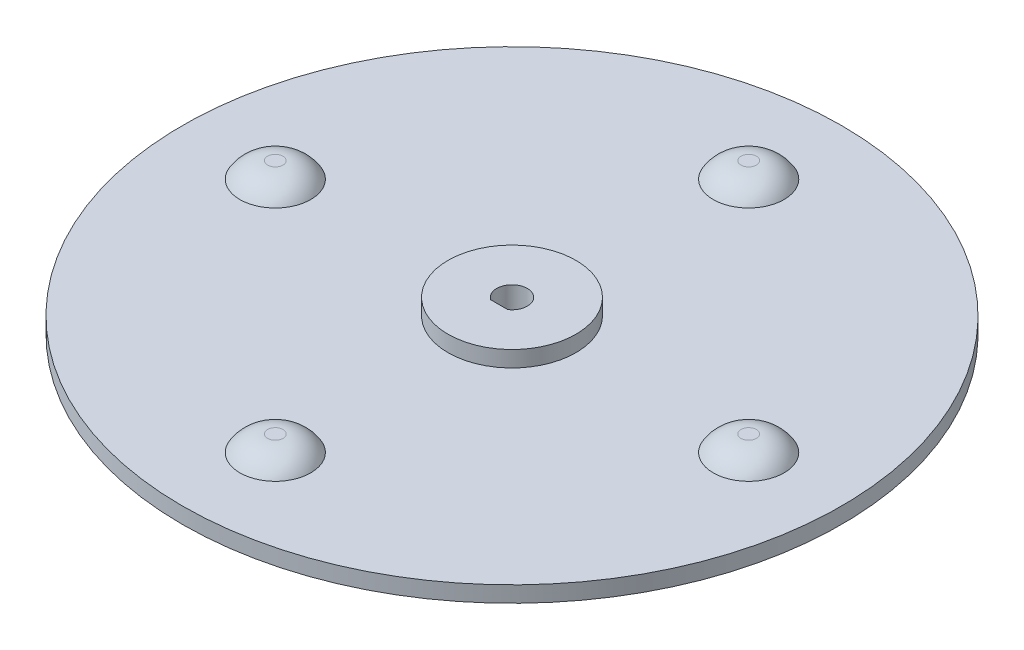
ISO-10303-21;
HEADER;
FILE_DESCRIPTION(('STEP AP214'),'2;1');
FILE_NAME('part.step','',(''),(''),'','','');
FILE_SCHEMA(('AUTOMOTIVE_DESIGN { 1 0 10303 214 1 1 1 1 }'));
ENDSEC;
DATA;
#1=APPLICATION_CONTEXT('core data for automotive mechanical design processes');
#2=APPLICATION_PROTOCOL_DEFINITION('international standard','automotive_design',2000,#1);
#3=PRODUCT_CONTEXT('',#1,'mechanical');
#4=PRODUCT('Part','Part','',(#3));
#5=PRODUCT_RELATED_PRODUCT_CATEGORY('part','',(#4));
#6=PRODUCT_DEFINITION_FORMATION('','',#4);
#7=PRODUCT_DEFINITION_CONTEXT('part definition',#1,'design');
#8=PRODUCT_DEFINITION('design','',#6,#7);
#9=PRODUCT_DEFINITION_SHAPE('','',#8);
#10=(LENGTH_UNIT() NAMED_UNIT(*) SI_UNIT(.MILLI.,.METRE.));
#11=(NAMED_UNIT(*) PLANE_ANGLE_UNIT() SI_UNIT($,.RADIAN.));
#12=(NAMED_UNIT(*) SI_UNIT($,.STERADIAN.) SOLID_ANGLE_UNIT());
#13=UNCERTAINTY_MEASURE_WITH_UNIT(LENGTH_MEASURE(1.E-05),#10,'distance_accuracy_value','');
#14=(GEOMETRIC_REPRESENTATION_CONTEXT(3) GLOBAL_UNCERTAINTY_ASSIGNED_CONTEXT((#13)) GLOBAL_UNIT_ASSIGNED_CONTEXT((#10,
#11,#12)) REPRESENTATION_CONTEXT('',''));
#15=CARTESIAN_POINT('',(0.,0.,0.));
#16=DIRECTION('',(0.,0.,1.));
#17=DIRECTION('',(1.,0.,0.));
#18=AXIS2_PLACEMENT_3D('',#15,#16,#17);
#19=CARTESIAN_POINT('',(0.,3.175,0.));
#20=DIRECTION('',(0.,-1.,0.));
#21=DIRECTION('',(0.,0.,-1.));
#22=AXIS2_PLACEMENT_3D('',#19,#20,#21);
#23=CYLINDRICAL_SURFACE('',#22,65.405);
#24=CARTESIAN_POINT('',(0.,3.175,0.));
#25=DIRECTION('',(0.,1.,0.));
#26=DIRECTION('',(0.,0.,1.));
#27=AXIS2_PLACEMENT_3D('',#24,#25,#26);
#28=CIRCLE('',#27,65.405);
#29=CARTESIAN_POINT('',(0.,3.175,65.405));
#30=VERTEX_POINT('',#29);
#31=EDGE_CURVE('E111',#30,#30,#28,.T.);
#32=ORIENTED_EDGE('',*,*,#31,.F.);
#33=EDGE_LOOP('',(#32));
#34=FACE_BOUND('',#33,.T.);
#35=CARTESIAN_POINT('',(0.,0.,0.));
#36=DIRECTION('',(0.,1.,0.));
#37=DIRECTION('',(0.,0.,1.));
#38=AXIS2_PLACEMENT_3D('',#35,#36,#37);
#39=CIRCLE('',#38,65.405);
#40=CARTESIAN_POINT('',(0.,0.,65.405));
#41=VERTEX_POINT('',#40);
#42=EDGE_CURVE('E105',#41,#41,#39,.T.);
#43=ORIENTED_EDGE('',*,*,#42,.T.);
#44=EDGE_LOOP('',(#43));
#45=FACE_BOUND('',#44,.T.);
#46=ADVANCED_FACE('F45',(#34,#45),#23,.T.);
#47=CARTESIAN_POINT('',(0.,3.175,0.));
#48=DIRECTION('',(0.,1.,0.));
#49=DIRECTION('',(0.,0.,1.));
#50=AXIS2_PLACEMENT_3D('',#47,#48,#49);
#51=PLANE('',#50);
#52=CARTESIAN_POINT('',(-46.9731498971295,3.175,-4.92017628877526E-13));
#53=DIRECTION('',(0.,1.,0.));
#54=DIRECTION('',(0.,0.,1.));
#55=AXIS2_PLACEMENT_3D('',#52,#53,#54);
#56=CIRCLE('',#55,7.03225048164094);
#57=CARTESIAN_POINT('',(-46.9731498971295,3.175,7.03225048164045));
#58=VERTEX_POINT('',#57);
#59=EDGE_CURVE('E299',#58,#58,#56,.T.);
#60=ORIENTED_EDGE('',*,*,#59,.F.);
#61=EDGE_LOOP('',(#60));
#62=FACE_BOUND('',#61,.T.);
#63=CARTESIAN_POINT('',(-3.28011752585018E-13,3.175,46.9731498971295));
#64=DIRECTION('',(0.,1.,0.));
#65=DIRECTION('',(0.,0.,1.));
#66=AXIS2_PLACEMENT_3D('',#63,#64,#65);
#67=CIRCLE('',#66,7.03225048164094);
#68=CARTESIAN_POINT('',(-3.28011752585018E-13,3.175,54.0054003787704));
#69=VERTEX_POINT('',#68);
#70=EDGE_CURVE('E296',#69,#69,#67,.T.);
#71=ORIENTED_EDGE('',*,*,#70,.F.);
#72=EDGE_LOOP('',(#71));
#73=FACE_BOUND('',#72,.T.);
#74=CARTESIAN_POINT('',(46.9731498971295,3.175,1.64005876292509E-13));
#75=DIRECTION('',(0.,1.,0.));
#76=DIRECTION('',(0.,0.,1.));
#77=AXIS2_PLACEMENT_3D('',#74,#75,#76);
#78=CIRCLE('',#77,7.03225048164094);
#79=CARTESIAN_POINT('',(46.9731498971295,3.175,7.03225048164111));
#80=VERTEX_POINT('',#79);
#81=EDGE_CURVE('E94',#80,#80,#78,.T.);
#82=ORIENTED_EDGE('',*,*,#81,.F.);
#83=EDGE_LOOP('',(#82));
#84=FACE_BOUND('',#83,.T.);
#85=CARTESIAN_POINT('',(0.,3.175,-46.9731498971295));
#86=DIRECTION('',(0.,1.,0.));
#87=DIRECTION('',(0.,0.,1.));
#88=AXIS2_PLACEMENT_3D('',#85,#86,#87);
#89=CIRCLE('',#88,7.03225048164094);
#90=CARTESIAN_POINT('',(0.,3.175,-39.9408994154885));
#91=VERTEX_POINT('',#90);
#92=EDGE_CURVE('E90',#91,#91,#89,.T.);
#93=ORIENTED_EDGE('',*,*,#92,.F.);
#94=EDGE_LOOP('',(#93));
#95=FACE_BOUND('',#94,.T.);
#96=CARTESIAN_POINT('',(0.,3.175,0.));
#97=DIRECTION('',(0.,1.,0.));
#98=DIRECTION('',(0.,0.,1.));
#99=AXIS2_PLACEMENT_3D('',#96,#97,#98);
#100=CIRCLE('',#99,12.7);
#101=CARTESIAN_POINT('',(0.,3.175,12.7));
#102=VERTEX_POINT('',#101);
#103=EDGE_CURVE('E106',#102,#102,#100,.T.);
#104=ORIENTED_EDGE('',*,*,#103,.F.);
#105=EDGE_LOOP('',(#104));
#106=FACE_BOUND('',#105,.T.);
#107=ORIENTED_EDGE('',*,*,#31,.T.);
#108=EDGE_LOOP('',(#107));
#109=FACE_BOUND('',#108,.T.);
#110=ADVANCED_FACE('F144',(#62,#73,#84,#95,#106,#109),#51,.T.);
#111=CARTESIAN_POINT('',(0.,0.,0.));
#112=DIRECTION('',(0.,1.,0.));
#113=DIRECTION('',(0.,0.,1.));
#114=AXIS2_PLACEMENT_3D('',#111,#112,#113);
#115=PLANE('',#114);
#116=ORIENTED_EDGE('',*,*,#42,.F.);
#117=EDGE_LOOP('',(#116));
#118=FACE_BOUND('',#117,.T.);
#119=ADVANCED_FACE('F151',(#118),#115,.F.);
#120=CARTESIAN_POINT('',(0.,6.35,0.));
#121=DIRECTION('',(0.,-1.,0.));
#122=DIRECTION('',(0.,0.,-1.));
#123=AXIS2_PLACEMENT_3D('',#120,#121,#122);
#124=CYLINDRICAL_SURFACE('',#123,12.7);
#125=CARTESIAN_POINT('',(0.,6.35,0.));
#126=DIRECTION('',(0.,1.,0.));
#127=DIRECTION('',(0.,0.,1.));
#128=AXIS2_PLACEMENT_3D('',#125,#126,#127);
#129=CIRCLE('',#128,12.7);
#130=CARTESIAN_POINT('',(0.,6.35,12.7));
#131=VERTEX_POINT('',#130);
#132=EDGE_CURVE('E78',#131,#131,#129,.T.);
#133=ORIENTED_EDGE('',*,*,#132,.F.);
#134=EDGE_LOOP('',(#133));
#135=FACE_BOUND('',#134,.T.);
#136=ORIENTED_EDGE('',*,*,#103,.T.);
#137=EDGE_LOOP('',(#136));
#138=FACE_BOUND('',#137,.T.);
#139=ADVANCED_FACE('F191',(#135,#138),#124,.T.);
#140=CARTESIAN_POINT('',(0.,6.35,0.));
#141=DIRECTION('',(0.,1.,0.));
#142=DIRECTION('',(0.,0.,1.));
#143=AXIS2_PLACEMENT_3D('',#140,#141,#142);
#144=PLANE('',#143);
#145=CARTESIAN_POINT('',(0.,6.35,0.));
#146=DIRECTION('',(0.,1.,0.));
#147=DIRECTION('',(0.,0.,1.));
#148=AXIS2_PLACEMENT_3D('',#145,#146,#147);
#149=CIRCLE('',#148,3.048);
#150=CARTESIAN_POINT('',(1.68484539350054,6.35,2.54));
#151=VERTEX_POINT('',#150);
#152=CARTESIAN_POINT('',(-1.68484539350054,6.35,2.54));
#153=VERTEX_POINT('',#152);
#154=EDGE_CURVE('E61',#151,#153,#149,.T.);
#155=ORIENTED_EDGE('',*,*,#154,.F.);
#156=DIRECTION('',(1.,0.,0.));
#157=VECTOR('',#156,1.);
#158=CARTESIAN_POINT('',(-1.68484539350054,6.35,2.54));
#159=LINE('',#158,#157);
#160=EDGE_CURVE('E82',#153,#151,#159,.T.);
#161=ORIENTED_EDGE('',*,*,#160,.F.);
#162=EDGE_LOOP('',(#155,#161));
#163=FACE_BOUND('',#162,.T.);
#164=ORIENTED_EDGE('',*,*,#132,.T.);
#165=EDGE_LOOP('',(#164));
#166=FACE_BOUND('',#165,.T.);
#167=ADVANCED_FACE('F87',(#163,#166),#144,.T.);
#168=CARTESIAN_POINT('',(0.,0.508,0.));
#169=DIRECTION('',(0.,1.,0.));
#170=DIRECTION('',(0.,0.,1.));
#171=AXIS2_PLACEMENT_3D('',#168,#169,#170);
#172=CYLINDRICAL_SURFACE('',#171,3.048);
#173=ORIENTED_EDGE('',*,*,#154,.T.);
#174=DIRECTION('',(0.,1.,0.));
#175=VECTOR('',#174,1.);
#176=CARTESIAN_POINT('',(-1.68484539350054,0.508,2.54));
#177=LINE('',#176,#175);
#178=CARTESIAN_POINT('',(-1.68484539350054,0.508,2.54));
#179=VERTEX_POINT('',#178);
#180=EDGE_CURVE('E79',#179,#153,#177,.T.);
#181=ORIENTED_EDGE('',*,*,#180,.F.);
#182=CARTESIAN_POINT('',(0.,0.508,0.));
#183=DIRECTION('',(0.,1.,0.));
#184=DIRECTION('',(0.,0.,1.));
#185=AXIS2_PLACEMENT_3D('',#182,#183,#184);
#186=CIRCLE('',#185,3.048);
#187=CARTESIAN_POINT('',(1.68484539350054,0.508,2.54));
#188=VERTEX_POINT('',#187);
#189=EDGE_CURVE('E75',#188,#179,#186,.T.);
#190=ORIENTED_EDGE('',*,*,#189,.F.);
#191=DIRECTION('',(0.,1.,0.));
#192=VECTOR('',#191,1.);
#193=CARTESIAN_POINT('',(1.68484539350054,0.508,2.54));
#194=LINE('',#193,#192);
#195=EDGE_CURVE('E69',#188,#151,#194,.T.);
#196=ORIENTED_EDGE('',*,*,#195,.T.);
#197=EDGE_LOOP('',(#173,#181,#190,#196));
#198=FACE_BOUND('',#197,.T.);
#199=ADVANCED_FACE('F73',(#198),#172,.F.);
#200=CARTESIAN_POINT('',(-1.68484539350054,0.508,2.54));
#201=DIRECTION('',(0.,0.,1.));
#202=DIRECTION('',(1.,0.,0.));
#203=AXIS2_PLACEMENT_3D('',#200,#201,#202);
#204=PLANE('',#203);
#205=ORIENTED_EDGE('',*,*,#160,.T.);
#206=ORIENTED_EDGE('',*,*,#195,.F.);
#207=DIRECTION('',(1.,0.,0.));
#208=VECTOR('',#207,1.);
#209=CARTESIAN_POINT('',(-1.68484539350054,0.508,2.54));
#210=LINE('',#209,#208);
#211=EDGE_CURVE('E97',#179,#188,#210,.T.);
#212=ORIENTED_EDGE('',*,*,#211,.F.);
#213=ORIENTED_EDGE('',*,*,#180,.T.);
#214=EDGE_LOOP('',(#205,#206,#212,#213));
#215=FACE_BOUND('',#214,.T.);
#216=ADVANCED_FACE('F83',(#215),#204,.F.);
#217=CARTESIAN_POINT('',(0.,0.508,0.));
#218=DIRECTION('',(0.,1.,0.));
#219=DIRECTION('',(0.,0.,1.));
#220=AXIS2_PLACEMENT_3D('',#217,#218,#219);
#221=PLANE('',#220);
#222=ORIENTED_EDGE('',*,*,#189,.T.);
#223=ORIENTED_EDGE('',*,*,#211,.T.);
#224=EDGE_LOOP('',(#222,#223));
#225=FACE_BOUND('',#224,.T.);
#226=ADVANCED_FACE('F173',(#225),#221,.T.);
#227=CARTESIAN_POINT('',(0.,6.35,-46.9731498971295));
#228=DIRECTION('',(0.,1.,0.));
#229=DIRECTION('',(0.,0.,1.));
#230=AXIS2_PLACEMENT_3D('',#227,#228,#229);
#231=PLANE('',#230);
#232=CARTESIAN_POINT('',(0.,6.35,-46.9731498971295));
#233=DIRECTION('',(0.,1.,0.));
#234=DIRECTION('',(0.,0.,1.));
#235=AXIS2_PLACEMENT_3D('',#232,#233,#234);
#236=CIRCLE('',#235,1.53298916760976);
#237=CARTESIAN_POINT('',(0.,6.35,-45.4401607295197));
#238=VERTEX_POINT('',#237);
#239=EDGE_CURVE('E110',#238,#238,#236,.T.);
#240=ORIENTED_EDGE('',*,*,#239,.T.);
#241=EDGE_LOOP('',(#240));
#242=FACE_BOUND('',#241,.T.);
#243=ADVANCED_FACE('F170',(#242),#231,.T.);
#244=CARTESIAN_POINT('',(46.9731498971295,6.35,1.64005876292509E-13));
#245=DIRECTION('',(0.,1.,0.));
#246=DIRECTION('',(0.,0.,1.));
#247=AXIS2_PLACEMENT_3D('',#244,#245,#246);
#248=PLANE('',#247);
#249=CARTESIAN_POINT('',(46.9731498971295,6.35,1.64005876292509E-13));
#250=DIRECTION('',(0.,1.,0.));
#251=DIRECTION('',(0.,0.,1.));
#252=AXIS2_PLACEMENT_3D('',#249,#250,#251);
#253=CIRCLE('',#252,1.53298916760976);
#254=CARTESIAN_POINT('',(46.9731498971295,6.35,1.53298916760992));
#255=VERTEX_POINT('',#254);
#256=EDGE_CURVE('E11',#255,#255,#253,.T.);
#257=ORIENTED_EDGE('',*,*,#256,.T.);
#258=EDGE_LOOP('',(#257));
#259=FACE_BOUND('',#258,.T.);
#260=ADVANCED_FACE('F172',(#259),#248,.T.);
#261=CARTESIAN_POINT('',(-3.28011752585018E-13,6.35,46.9731498971295));
#262=DIRECTION('',(0.,1.,0.));
#263=DIRECTION('',(0.,0.,1.));
#264=AXIS2_PLACEMENT_3D('',#261,#262,#263);
#265=PLANE('',#264);
#266=CARTESIAN_POINT('',(-3.28011752585018E-13,6.35,46.9731498971295));
#267=DIRECTION('',(0.,1.,0.));
#268=DIRECTION('',(0.,0.,1.));
#269=AXIS2_PLACEMENT_3D('',#266,#267,#268);
#270=CIRCLE('',#269,1.53298916760976);
#271=CARTESIAN_POINT('',(-3.28011752585018E-13,6.35,48.5061390647392));
#272=VERTEX_POINT('',#271);
#273=EDGE_CURVE('E54',#272,#272,#270,.T.);
#274=ORIENTED_EDGE('',*,*,#273,.T.);
#275=EDGE_LOOP('',(#274));
#276=FACE_BOUND('',#275,.T.);
#277=ADVANCED_FACE('F128',(#276),#265,.T.);
#278=CARTESIAN_POINT('',(-46.9731498971295,6.35,-4.92017628877526E-13));
#279=DIRECTION('',(0.,1.,0.));
#280=DIRECTION('',(0.,0.,1.));
#281=AXIS2_PLACEMENT_3D('',#278,#279,#280);
#282=PLANE('',#281);
#283=CARTESIAN_POINT('',(-46.9731498971295,6.35,-4.92017628877526E-13));
#284=DIRECTION('',(0.,1.,0.));
#285=DIRECTION('',(0.,0.,1.));
#286=AXIS2_PLACEMENT_3D('',#283,#284,#285);
#287=CIRCLE('',#286,1.53298916760976);
#288=CARTESIAN_POINT('',(-46.9731498971295,6.35,1.53298916760927));
#289=VERTEX_POINT('',#288);
#290=EDGE_CURVE('E121',#289,#289,#287,.T.);
#291=ORIENTED_EDGE('',*,*,#290,.T.);
#292=EDGE_LOOP('',(#291));
#293=FACE_BOUND('',#292,.T.);
#294=ADVANCED_FACE('F159',(#293),#282,.T.);
#295=CARTESIAN_POINT('',(0.,0.,-46.9731498971295));
#296=DIRECTION('',(0.,-1.,0.));
#297=DIRECTION('',(0.,0.,-1.));
#298=AXIS2_PLACEMENT_3D('',#295,#296,#297);
#299=DEGENERATE_TOROIDAL_SURFACE('',#298,1.53298916760976,6.35,.T.);
#300=ORIENTED_EDGE('',*,*,#92,.T.);
#301=EDGE_LOOP('',(#300));
#302=FACE_BOUND('',#301,.T.);
#303=ORIENTED_EDGE('',*,*,#239,.F.);
#304=EDGE_LOOP('',(#303));
#305=FACE_BOUND('',#304,.T.);
#306=ADVANCED_FACE('F139',(#302,#305),#299,.T.);
#307=CARTESIAN_POINT('',(-46.9731498971295,0.,-4.92017628877526E-13));
#308=DIRECTION('',(0.,-1.,0.));
#309=DIRECTION('',(0.,0.,-1.));
#310=AXIS2_PLACEMENT_3D('',#307,#308,#309);
#311=DEGENERATE_TOROIDAL_SURFACE('',#310,1.53298916760976,6.35,.T.);
#312=ORIENTED_EDGE('',*,*,#59,.T.);
#313=EDGE_LOOP('',(#312));
#314=FACE_BOUND('',#313,.T.);
#315=ORIENTED_EDGE('',*,*,#290,.F.);
#316=EDGE_LOOP('',(#315));
#317=FACE_BOUND('',#316,.T.);
#318=ADVANCED_FACE('F132',(#314,#317),#311,.T.);
#319=CARTESIAN_POINT('',(-3.28011752585018E-13,0.,46.9731498971295));
#320=DIRECTION('',(0.,-1.,0.));
#321=DIRECTION('',(0.,0.,-1.));
#322=AXIS2_PLACEMENT_3D('',#319,#320,#321);
#323=DEGENERATE_TOROIDAL_SURFACE('',#322,1.53298916760976,6.35,.T.);
#324=ORIENTED_EDGE('',*,*,#70,.T.);
#325=EDGE_LOOP('',(#324));
#326=FACE_BOUND('',#325,.T.);
#327=ORIENTED_EDGE('',*,*,#273,.F.);
#328=EDGE_LOOP('',(#327));
#329=FACE_BOUND('',#328,.T.);
#330=ADVANCED_FACE('F130',(#326,#329),#323,.T.);
#331=CARTESIAN_POINT('',(46.9731498971295,0.,1.64005876292509E-13));
#332=DIRECTION('',(0.,-1.,0.));
#333=DIRECTION('',(0.,0.,-1.));
#334=AXIS2_PLACEMENT_3D('',#331,#332,#333);
#335=DEGENERATE_TOROIDAL_SURFACE('',#334,1.53298916760976,6.35,.T.);
#336=ORIENTED_EDGE('',*,*,#81,.T.);
#337=EDGE_LOOP('',(#336));
#338=FACE_BOUND('',#337,.T.);
#339=ORIENTED_EDGE('',*,*,#256,.F.);
#340=EDGE_LOOP('',(#339));
#341=FACE_BOUND('',#340,.T.);
#342=ADVANCED_FACE('F47',(#338,#341),#335,.T.);
#343=CLOSED_SHELL('',(#46,#110,#119,#139,#167,#199,#216,#226,#243,#260,#277,#294,#306,#318,#330,#342));
#344=MANIFOLD_SOLID_BREP('B2',#343);
#345=ADVANCED_BREP_SHAPE_REPRESENTATION('',(#18,#344),#14);
#346=SHAPE_DEFINITION_REPRESENTATION(#9,#345);
ENDSEC;
END-ISO-10303-21;
